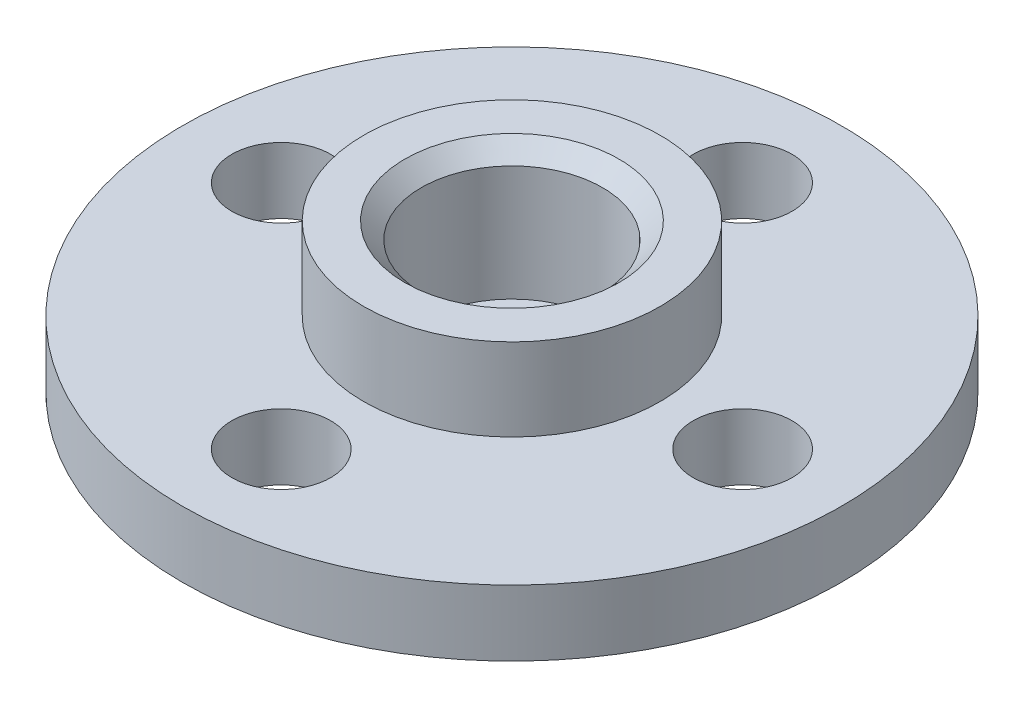
ISO-10303-21;
HEADER;
FILE_DESCRIPTION(('STEP AP214'),'2;1');
FILE_NAME('part.step','',(''),(''),'','','');
FILE_SCHEMA(('AUTOMOTIVE_DESIGN { 1 0 10303 214 1 1 1 1 }'));
ENDSEC;
DATA;
#1=APPLICATION_CONTEXT('core data for automotive mechanical design processes');
#2=APPLICATION_PROTOCOL_DEFINITION('international standard','automotive_design',2000,#1);
#3=PRODUCT_CONTEXT('',#1,'mechanical');
#4=PRODUCT('Part','Part','',(#3));
#5=PRODUCT_RELATED_PRODUCT_CATEGORY('part','',(#4));
#6=PRODUCT_DEFINITION_FORMATION('','',#4);
#7=PRODUCT_DEFINITION_CONTEXT('part definition',#1,'design');
#8=PRODUCT_DEFINITION('design','',#6,#7);
#9=PRODUCT_DEFINITION_SHAPE('','',#8);
#10=(LENGTH_UNIT() NAMED_UNIT(*) SI_UNIT(.MILLI.,.METRE.));
#11=(NAMED_UNIT(*) PLANE_ANGLE_UNIT() SI_UNIT($,.RADIAN.));
#12=(NAMED_UNIT(*) SI_UNIT($,.STERADIAN.) SOLID_ANGLE_UNIT());
#13=UNCERTAINTY_MEASURE_WITH_UNIT(LENGTH_MEASURE(1.E-05),#10,'distance_accuracy_value','');
#14=(GEOMETRIC_REPRESENTATION_CONTEXT(3) GLOBAL_UNCERTAINTY_ASSIGNED_CONTEXT((#13)) GLOBAL_UNIT_ASSIGNED_CONTEXT((#10,
#11,#12)) REPRESENTATION_CONTEXT('',''));
#15=CARTESIAN_POINT('',(0.,0.,0.));
#16=DIRECTION('',(0.,0.,1.));
#17=DIRECTION('',(1.,0.,0.));
#18=AXIS2_PLACEMENT_3D('',#15,#16,#17);
#19=CARTESIAN_POINT('',(0.,2.,0.));
#20=DIRECTION('',(0.,-1.,0.));
#21=DIRECTION('',(0.,0.,-1.));
#22=AXIS2_PLACEMENT_3D('',#19,#20,#21);
#23=CYLINDRICAL_SURFACE('',#22,10.);
#24=CARTESIAN_POINT('',(0.,2.,0.));
#25=DIRECTION('',(0.,1.,0.));
#26=DIRECTION('',(0.,0.,1.));
#27=AXIS2_PLACEMENT_3D('',#24,#25,#26);
#28=CIRCLE('',#27,10.);
#29=CARTESIAN_POINT('',(0.,2.,10.));
#30=VERTEX_POINT('',#29);
#31=EDGE_CURVE('E51',#30,#30,#28,.T.);
#32=ORIENTED_EDGE('',*,*,#31,.F.);
#33=EDGE_LOOP('',(#32));
#34=FACE_BOUND('',#33,.T.);
#35=CARTESIAN_POINT('',(0.,0.,0.));
#36=DIRECTION('',(0.,1.,0.));
#37=DIRECTION('',(0.,0.,1.));
#38=AXIS2_PLACEMENT_3D('',#35,#36,#37);
#39=CIRCLE('',#38,10.);
#40=CARTESIAN_POINT('',(0.,0.,10.));
#41=VERTEX_POINT('',#40);
#42=EDGE_CURVE('E55',#41,#41,#39,.T.);
#43=ORIENTED_EDGE('',*,*,#42,.T.);
#44=EDGE_LOOP('',(#43));
#45=FACE_BOUND('',#44,.T.);
#46=ADVANCED_FACE('F39',(#34,#45),#23,.T.);
#47=CARTESIAN_POINT('',(0.,2.,0.));
#48=DIRECTION('',(0.,1.,0.));
#49=DIRECTION('',(0.,0.,1.));
#50=AXIS2_PLACEMENT_3D('',#47,#48,#49);
#51=PLANE('',#50);
#52=CARTESIAN_POINT('',(0.,2.,0.));
#53=DIRECTION('',(0.,1.,0.));
#54=DIRECTION('',(0.,0.,1.));
#55=AXIS2_PLACEMENT_3D('',#52,#53,#54);
#56=CIRCLE('',#55,4.5);
#57=CARTESIAN_POINT('',(0.,2.,4.5));
#58=VERTEX_POINT('',#57);
#59=EDGE_CURVE('E90',#58,#58,#56,.T.);
#60=ORIENTED_EDGE('',*,*,#59,.F.);
#61=EDGE_LOOP('',(#60));
#62=FACE_BOUND('',#61,.T.);
#63=CARTESIAN_POINT('',(-7.,2.,0.));
#64=DIRECTION('',(0.,1.,0.));
#65=DIRECTION('',(0.,0.,1.));
#66=AXIS2_PLACEMENT_3D('',#63,#64,#65);
#67=CIRCLE('',#66,1.5);
#68=CARTESIAN_POINT('',(-7.,2.,1.5));
#69=VERTEX_POINT('',#68);
#70=EDGE_CURVE('E85',#69,#69,#67,.T.);
#71=ORIENTED_EDGE('',*,*,#70,.F.);
#72=EDGE_LOOP('',(#71));
#73=FACE_BOUND('',#72,.T.);
#74=CARTESIAN_POINT('',(0.,2.,-7.));
#75=DIRECTION('',(0.,1.,0.));
#76=DIRECTION('',(0.,0.,1.));
#77=AXIS2_PLACEMENT_3D('',#74,#75,#76);
#78=CIRCLE('',#77,1.5);
#79=CARTESIAN_POINT('',(0.,2.,-5.5));
#80=VERTEX_POINT('',#79);
#81=EDGE_CURVE('E82',#80,#80,#78,.T.);
#82=ORIENTED_EDGE('',*,*,#81,.F.);
#83=EDGE_LOOP('',(#82));
#84=FACE_BOUND('',#83,.T.);
#85=CARTESIAN_POINT('',(7.,2.,0.));
#86=DIRECTION('',(0.,1.,0.));
#87=DIRECTION('',(0.,0.,1.));
#88=AXIS2_PLACEMENT_3D('',#85,#86,#87);
#89=CIRCLE('',#88,1.5);
#90=CARTESIAN_POINT('',(7.,2.,1.50000000000005));
#91=VERTEX_POINT('',#90);
#92=EDGE_CURVE('E76',#91,#91,#89,.T.);
#93=ORIENTED_EDGE('',*,*,#92,.F.);
#94=EDGE_LOOP('',(#93));
#95=FACE_BOUND('',#94,.T.);
#96=CARTESIAN_POINT('',(0.,2.,7.));
#97=DIRECTION('',(0.,1.,0.));
#98=DIRECTION('',(0.,0.,1.));
#99=AXIS2_PLACEMENT_3D('',#96,#97,#98);
#100=CIRCLE('',#99,1.5);
#101=CARTESIAN_POINT('',(0.,2.,8.5));
#102=VERTEX_POINT('',#101);
#103=EDGE_CURVE('E69',#102,#102,#100,.T.);
#104=ORIENTED_EDGE('',*,*,#103,.F.);
#105=EDGE_LOOP('',(#104));
#106=FACE_BOUND('',#105,.T.);
#107=ORIENTED_EDGE('',*,*,#31,.T.);
#108=EDGE_LOOP('',(#107));
#109=FACE_BOUND('',#108,.T.);
#110=ADVANCED_FACE('F120',(#62,#73,#84,#95,#106,#109),#51,.T.);
#111=CARTESIAN_POINT('',(0.,0.,0.));
#112=DIRECTION('',(0.,1.,0.));
#113=DIRECTION('',(0.,0.,1.));
#114=AXIS2_PLACEMENT_3D('',#111,#112,#113);
#115=PLANE('',#114);
#116=CARTESIAN_POINT('',(0.,0.,0.));
#117=DIRECTION('',(0.,1.,0.));
#118=DIRECTION('',(0.,0.,1.));
#119=AXIS2_PLACEMENT_3D('',#116,#117,#118);
#120=CIRCLE('',#119,1.5);
#121=CARTESIAN_POINT('',(0.,0.,1.5));
#122=VERTEX_POINT('',#121);
#123=EDGE_CURVE('E58',#122,#122,#120,.T.);
#124=ORIENTED_EDGE('',*,*,#123,.T.);
#125=EDGE_LOOP('',(#124));
#126=FACE_BOUND('',#125,.T.);
#127=CARTESIAN_POINT('',(-7.,0.,0.));
#128=DIRECTION('',(0.,1.,0.));
#129=DIRECTION('',(0.,0.,1.));
#130=AXIS2_PLACEMENT_3D('',#127,#128,#129);
#131=CIRCLE('',#130,1.5);
#132=CARTESIAN_POINT('',(-7.,0.,1.5));
#133=VERTEX_POINT('',#132);
#134=EDGE_CURVE('E64',#133,#133,#131,.T.);
#135=ORIENTED_EDGE('',*,*,#134,.T.);
#136=EDGE_LOOP('',(#135));
#137=FACE_BOUND('',#136,.T.);
#138=CARTESIAN_POINT('',(0.,0.,-7.));
#139=DIRECTION('',(0.,1.,0.));
#140=DIRECTION('',(0.,0.,1.));
#141=AXIS2_PLACEMENT_3D('',#138,#139,#140);
#142=CIRCLE('',#141,1.5);
#143=CARTESIAN_POINT('',(0.,0.,-5.5));
#144=VERTEX_POINT('',#143);
#145=EDGE_CURVE('E79',#144,#144,#142,.T.);
#146=ORIENTED_EDGE('',*,*,#145,.T.);
#147=EDGE_LOOP('',(#146));
#148=FACE_BOUND('',#147,.T.);
#149=CARTESIAN_POINT('',(7.,0.,0.));
#150=DIRECTION('',(0.,1.,0.));
#151=DIRECTION('',(0.,0.,1.));
#152=AXIS2_PLACEMENT_3D('',#149,#150,#151);
#153=CIRCLE('',#152,1.5);
#154=CARTESIAN_POINT('',(7.,0.,1.50000000000005));
#155=VERTEX_POINT('',#154);
#156=EDGE_CURVE('E73',#155,#155,#153,.T.);
#157=ORIENTED_EDGE('',*,*,#156,.T.);
#158=EDGE_LOOP('',(#157));
#159=FACE_BOUND('',#158,.T.);
#160=CARTESIAN_POINT('',(0.,0.,7.));
#161=DIRECTION('',(0.,1.,0.));
#162=DIRECTION('',(0.,0.,1.));
#163=AXIS2_PLACEMENT_3D('',#160,#161,#162);
#164=CIRCLE('',#163,1.5);
#165=CARTESIAN_POINT('',(0.,0.,8.5));
#166=VERTEX_POINT('',#165);
#167=EDGE_CURVE('E66',#166,#166,#164,.T.);
#168=ORIENTED_EDGE('',*,*,#167,.T.);
#169=EDGE_LOOP('',(#168));
#170=FACE_BOUND('',#169,.T.);
#171=ORIENTED_EDGE('',*,*,#42,.F.);
#172=EDGE_LOOP('',(#171));
#173=FACE_BOUND('',#172,.T.);
#174=ADVANCED_FACE('F126',(#126,#137,#148,#159,#170,#173),#115,.F.);
#175=CARTESIAN_POINT('',(0.,0.,7.));
#176=DIRECTION('',(0.,1.,0.));
#177=DIRECTION('',(0.,0.,1.));
#178=AXIS2_PLACEMENT_3D('',#175,#176,#177);
#179=CYLINDRICAL_SURFACE('',#178,1.5);
#180=ORIENTED_EDGE('',*,*,#167,.F.);
#181=EDGE_LOOP('',(#180));
#182=FACE_BOUND('',#181,.T.);
#183=ORIENTED_EDGE('',*,*,#103,.T.);
#184=EDGE_LOOP('',(#183));
#185=FACE_BOUND('',#184,.T.);
#186=ADVANCED_FACE('F133',(#182,#185),#179,.F.);
#187=CARTESIAN_POINT('',(7.,0.,0.));
#188=DIRECTION('',(0.,1.,0.));
#189=DIRECTION('',(0.,0.,1.));
#190=AXIS2_PLACEMENT_3D('',#187,#188,#189);
#191=CYLINDRICAL_SURFACE('',#190,1.5);
#192=ORIENTED_EDGE('',*,*,#156,.F.);
#193=EDGE_LOOP('',(#192));
#194=FACE_BOUND('',#193,.T.);
#195=ORIENTED_EDGE('',*,*,#92,.T.);
#196=EDGE_LOOP('',(#195));
#197=FACE_BOUND('',#196,.T.);
#198=ADVANCED_FACE('F137',(#194,#197),#191,.F.);
#199=CARTESIAN_POINT('',(0.,0.,-7.));
#200=DIRECTION('',(0.,1.,0.));
#201=DIRECTION('',(0.,0.,1.));
#202=AXIS2_PLACEMENT_3D('',#199,#200,#201);
#203=CYLINDRICAL_SURFACE('',#202,1.5);
#204=ORIENTED_EDGE('',*,*,#145,.F.);
#205=EDGE_LOOP('',(#204));
#206=FACE_BOUND('',#205,.T.);
#207=ORIENTED_EDGE('',*,*,#81,.T.);
#208=EDGE_LOOP('',(#207));
#209=FACE_BOUND('',#208,.T.);
#210=ADVANCED_FACE('F141',(#206,#209),#203,.F.);
#211=CARTESIAN_POINT('',(-7.,0.,0.));
#212=DIRECTION('',(0.,1.,0.));
#213=DIRECTION('',(0.,0.,1.));
#214=AXIS2_PLACEMENT_3D('',#211,#212,#213);
#215=CYLINDRICAL_SURFACE('',#214,1.5);
#216=ORIENTED_EDGE('',*,*,#134,.F.);
#217=EDGE_LOOP('',(#216));
#218=FACE_BOUND('',#217,.T.);
#219=ORIENTED_EDGE('',*,*,#70,.T.);
#220=EDGE_LOOP('',(#219));
#221=FACE_BOUND('',#220,.T.);
#222=ADVANCED_FACE('F145',(#218,#221),#215,.F.);
#223=CARTESIAN_POINT('',(0.,4.5,0.));
#224=DIRECTION('',(0.,-1.,0.));
#225=DIRECTION('',(0.,0.,-1.));
#226=AXIS2_PLACEMENT_3D('',#223,#224,#225);
#227=CYLINDRICAL_SURFACE('',#226,4.5);
#228=CARTESIAN_POINT('',(0.,4.5,0.));
#229=DIRECTION('',(0.,1.,0.));
#230=DIRECTION('',(0.,0.,1.));
#231=AXIS2_PLACEMENT_3D('',#228,#229,#230);
#232=CIRCLE('',#231,4.5);
#233=CARTESIAN_POINT('',(0.,4.5,4.5));
#234=VERTEX_POINT('',#233);
#235=EDGE_CURVE('E70',#234,#234,#232,.T.);
#236=ORIENTED_EDGE('',*,*,#235,.F.);
#237=EDGE_LOOP('',(#236));
#238=FACE_BOUND('',#237,.T.);
#239=ORIENTED_EDGE('',*,*,#59,.T.);
#240=EDGE_LOOP('',(#239));
#241=FACE_BOUND('',#240,.T.);
#242=ADVANCED_FACE('F117',(#238,#241),#227,.T.);
#243=CARTESIAN_POINT('',(0.,4.5,0.));
#244=DIRECTION('',(0.,1.,0.));
#245=DIRECTION('',(0.,0.,1.));
#246=AXIS2_PLACEMENT_3D('',#243,#244,#245);
#247=PLANE('',#246);
#248=CARTESIAN_POINT('',(0.,4.5,0.));
#249=DIRECTION('',(0.,1.,0.));
#250=DIRECTION('',(0.,0.,1.));
#251=AXIS2_PLACEMENT_3D('',#248,#249,#250);
#252=CIRCLE('',#251,3.25000000000001);
#253=CARTESIAN_POINT('',(0.,4.5,3.25000000000001));
#254=VERTEX_POINT('',#253);
#255=EDGE_CURVE('E10',#254,#254,#252,.F.);
#256=ORIENTED_EDGE('',*,*,#255,.T.);
#257=EDGE_LOOP('',(#256));
#258=FACE_BOUND('',#257,.T.);
#259=ORIENTED_EDGE('',*,*,#235,.T.);
#260=EDGE_LOOP('',(#259));
#261=FACE_BOUND('',#260,.T.);
#262=ADVANCED_FACE('F111',(#258,#261),#247,.T.);
#263=CARTESIAN_POINT('',(0.,0.5,0.));
#264=DIRECTION('',(0.,1.,0.));
#265=DIRECTION('',(0.,0.,1.));
#266=AXIS2_PLACEMENT_3D('',#263,#264,#265);
#267=CYLINDRICAL_SURFACE('',#266,2.75);
#268=CARTESIAN_POINT('',(0.,3.99999999999999,0.));
#269=DIRECTION('',(0.,1.,0.));
#270=DIRECTION('',(0.,0.,1.));
#271=AXIS2_PLACEMENT_3D('',#268,#269,#270);
#272=CIRCLE('',#271,2.75);
#273=CARTESIAN_POINT('',(0.,3.99999999999999,2.75));
#274=VERTEX_POINT('',#273);
#275=EDGE_CURVE('E47',#274,#274,#272,.T.);
#276=ORIENTED_EDGE('',*,*,#275,.T.);
#277=EDGE_LOOP('',(#276));
#278=FACE_BOUND('',#277,.T.);
#279=CARTESIAN_POINT('',(0.,0.5,0.));
#280=DIRECTION('',(0.,1.,0.));
#281=DIRECTION('',(0.,0.,1.));
#282=AXIS2_PLACEMENT_3D('',#279,#280,#281);
#283=CIRCLE('',#282,2.75);
#284=CARTESIAN_POINT('',(0.,0.5,2.75));
#285=VERTEX_POINT('',#284);
#286=EDGE_CURVE('E61',#285,#285,#283,.T.);
#287=ORIENTED_EDGE('',*,*,#286,.F.);
#288=EDGE_LOOP('',(#287));
#289=FACE_BOUND('',#288,.T.);
#290=ADVANCED_FACE('F106',(#278,#289),#267,.F.);
#291=CARTESIAN_POINT('',(0.,0.5,0.));
#292=DIRECTION('',(0.,1.,0.));
#293=DIRECTION('',(0.,0.,1.));
#294=AXIS2_PLACEMENT_3D('',#291,#292,#293);
#295=PLANE('',#294);
#296=CARTESIAN_POINT('',(0.,0.5,0.));
#297=DIRECTION('',(0.,1.,0.));
#298=DIRECTION('',(0.,0.,1.));
#299=AXIS2_PLACEMENT_3D('',#296,#297,#298);
#300=CIRCLE('',#299,1.5);
#301=CARTESIAN_POINT('',(0.,0.5,1.5));
#302=VERTEX_POINT('',#301);
#303=EDGE_CURVE('E62',#302,#302,#300,.T.);
#304=ORIENTED_EDGE('',*,*,#303,.F.);
#305=EDGE_LOOP('',(#304));
#306=FACE_BOUND('',#305,.T.);
#307=ORIENTED_EDGE('',*,*,#286,.T.);
#308=EDGE_LOOP('',(#307));
#309=FACE_BOUND('',#308,.T.);
#310=ADVANCED_FACE('F103',(#306,#309),#295,.T.);
#311=CARTESIAN_POINT('',(0.,-3.5,0.));
#312=DIRECTION('',(0.,1.,0.));
#313=DIRECTION('',(0.,0.,1.));
#314=AXIS2_PLACEMENT_3D('',#311,#312,#313);
#315=CYLINDRICAL_SURFACE('',#314,1.5);
#316=ORIENTED_EDGE('',*,*,#303,.T.);
#317=EDGE_LOOP('',(#316));
#318=FACE_BOUND('',#317,.T.);
#319=ORIENTED_EDGE('',*,*,#123,.F.);
#320=EDGE_LOOP('',(#319));
#321=FACE_BOUND('',#320,.T.);
#322=ADVANCED_FACE('F100',(#318,#321),#315,.F.);
#323=CARTESIAN_POINT('',(0.,3.99999999999999,0.));
#324=DIRECTION('',(0.,1.,0.));
#325=DIRECTION('',(0.,0.,1.));
#326=AXIS2_PLACEMENT_3D('',#323,#324,#325);
#327=CONICAL_SURFACE('',#326,2.75,0.785398163397449);
#328=ORIENTED_EDGE('',*,*,#255,.F.);
#329=EDGE_LOOP('',(#328));
#330=FACE_BOUND('',#329,.T.);
#331=ORIENTED_EDGE('',*,*,#275,.F.);
#332=EDGE_LOOP('',(#331));
#333=FACE_BOUND('',#332,.T.);
#334=ADVANCED_FACE('F42',(#330,#333),#327,.F.);
#335=CLOSED_SHELL('',(#46,#110,#174,#186,#198,#210,#222,#242,#262,#290,#310,#322,#334));
#336=MANIFOLD_SOLID_BREP('B2',#335);
#337=ADVANCED_BREP_SHAPE_REPRESENTATION('',(#18,#336),#14);
#338=SHAPE_DEFINITION_REPRESENTATION(#9,#337);
ENDSEC;
END-ISO-10303-21;
